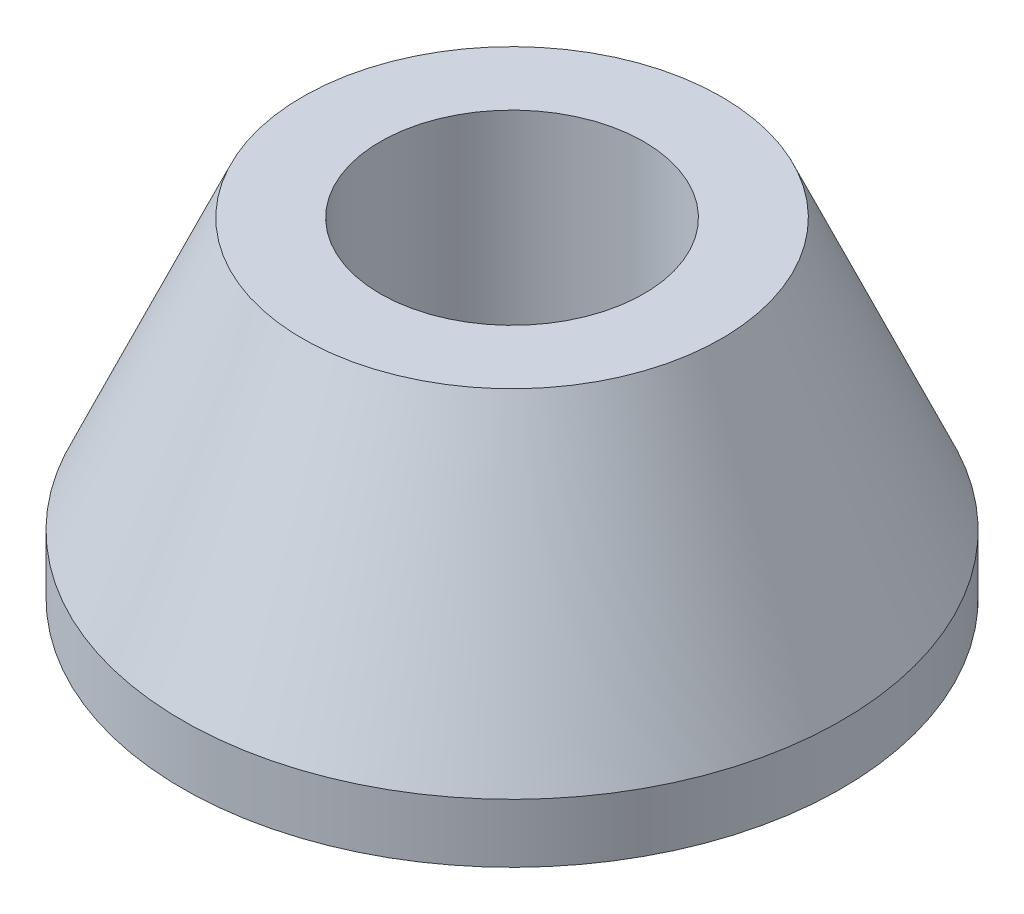
ISO-10303-21;
HEADER;
FILE_DESCRIPTION(('STEP AP214'),'2;1');
FILE_NAME('part.step','',(''),(''),'','','');
FILE_SCHEMA(('AUTOMOTIVE_DESIGN { 1 0 10303 214 1 1 1 1 }'));
ENDSEC;
DATA;
#1=APPLICATION_CONTEXT('core data for automotive mechanical design processes');
#2=APPLICATION_PROTOCOL_DEFINITION('international standard','automotive_design',2000,#1);
#3=PRODUCT_CONTEXT('',#1,'mechanical');
#4=PRODUCT('Part','Part','',(#3));
#5=PRODUCT_RELATED_PRODUCT_CATEGORY('part','',(#4));
#6=PRODUCT_DEFINITION_FORMATION('','',#4);
#7=PRODUCT_DEFINITION_CONTEXT('part definition',#1,'design');
#8=PRODUCT_DEFINITION('design','',#6,#7);
#9=PRODUCT_DEFINITION_SHAPE('','',#8);
#10=(LENGTH_UNIT() NAMED_UNIT(*) SI_UNIT(.MILLI.,.METRE.));
#11=(NAMED_UNIT(*) PLANE_ANGLE_UNIT() SI_UNIT($,.RADIAN.));
#12=(NAMED_UNIT(*) SI_UNIT($,.STERADIAN.) SOLID_ANGLE_UNIT());
#13=UNCERTAINTY_MEASURE_WITH_UNIT(LENGTH_MEASURE(1.E-05),#10,'distance_accuracy_value','');
#14=(GEOMETRIC_REPRESENTATION_CONTEXT(3) GLOBAL_UNCERTAINTY_ASSIGNED_CONTEXT((#13)) GLOBAL_UNIT_ASSIGNED_CONTEXT((#10,
#11,#12)) REPRESENTATION_CONTEXT('',''));
#15=CARTESIAN_POINT('',(0.,0.,0.));
#16=DIRECTION('',(0.,0.,1.));
#17=DIRECTION('',(1.,0.,0.));
#18=AXIS2_PLACEMENT_3D('',#15,#16,#17);
#19=CARTESIAN_POINT('',(0.,0.,0.));
#20=DIRECTION('',(0.,-1.,0.));
#21=DIRECTION('',(0.,0.,-1.));
#22=AXIS2_PLACEMENT_3D('',#19,#20,#21);
#23=CYLINDRICAL_SURFACE('',#22,2.43619489559165);
#24=CARTESIAN_POINT('',(0.,0.,0.));
#25=DIRECTION('',(0.,-1.,0.));
#26=DIRECTION('',(0.,0.,-1.));
#27=AXIS2_PLACEMENT_3D('',#24,#25,#26);
#28=CIRCLE('',#27,2.43619489559165);
#29=CARTESIAN_POINT('',(0.,0.,-2.43619489559165));
#30=VERTEX_POINT('',#29);
#31=EDGE_CURVE('E58',#30,#30,#28,.T.);
#32=ORIENTED_EDGE('',*,*,#31,.T.);
#33=EDGE_LOOP('',(#32));
#34=FACE_BOUND('',#33,.T.);
#35=CARTESIAN_POINT('',(0.,2.,0.));
#36=DIRECTION('',(0.,-1.,0.));
#37=DIRECTION('',(0.,0.,-1.));
#38=AXIS2_PLACEMENT_3D('',#35,#36,#37);
#39=CIRCLE('',#38,2.43619489559165);
#40=CARTESIAN_POINT('',(0.,2.,-2.43619489559165));
#41=VERTEX_POINT('',#40);
#42=EDGE_CURVE('E10',#41,#41,#39,.T.);
#43=ORIENTED_EDGE('',*,*,#42,.F.);
#44=EDGE_LOOP('',(#43));
#45=FACE_BOUND('',#44,.T.);
#46=ADVANCED_FACE('F33',(#34,#45),#23,.F.);
#47=CARTESIAN_POINT('',(0.,2.,0.));
#48=DIRECTION('',(0.,1.,0.));
#49=DIRECTION('',(0.,0.,1.));
#50=AXIS2_PLACEMENT_3D('',#47,#48,#49);
#51=PLANE('',#50);
#52=ORIENTED_EDGE('',*,*,#42,.T.);
#53=EDGE_LOOP('',(#52));
#54=FACE_BOUND('',#53,.T.);
#55=CARTESIAN_POINT('',(0.,2.,0.));
#56=DIRECTION('',(0.,-1.,0.));
#57=DIRECTION('',(0.,0.,-1.));
#58=AXIS2_PLACEMENT_3D('',#55,#56,#57);
#59=CIRCLE('',#58,6.);
#60=CARTESIAN_POINT('',(0.,2.,-6.));
#61=VERTEX_POINT('',#60);
#62=EDGE_CURVE('E39',#61,#61,#59,.T.);
#63=ORIENTED_EDGE('',*,*,#62,.F.);
#64=EDGE_LOOP('',(#63));
#65=FACE_BOUND('',#64,.T.);
#66=ADVANCED_FACE('F76',(#54,#65),#51,.T.);
#67=CARTESIAN_POINT('',(0.,0.,0.));
#68=DIRECTION('',(0.,-1.,0.));
#69=DIRECTION('',(0.,0.,-1.));
#70=AXIS2_PLACEMENT_3D('',#67,#68,#69);
#71=CYLINDRICAL_SURFACE('',#70,6.);
#72=ORIENTED_EDGE('',*,*,#62,.T.);
#73=EDGE_LOOP('',(#72));
#74=FACE_BOUND('',#73,.T.);
#75=CARTESIAN_POINT('',(0.,15.,0.));
#76=DIRECTION('',(0.,-1.,0.));
#77=DIRECTION('',(0.,0.,-1.));
#78=AXIS2_PLACEMENT_3D('',#75,#76,#77);
#79=CIRCLE('',#78,6.);
#80=CARTESIAN_POINT('',(0.,15.,-6.));
#81=VERTEX_POINT('',#80);
#82=EDGE_CURVE('E43',#81,#81,#79,.T.);
#83=ORIENTED_EDGE('',*,*,#82,.F.);
#84=EDGE_LOOP('',(#83));
#85=FACE_BOUND('',#84,.T.);
#86=ADVANCED_FACE('F80',(#74,#85),#71,.F.);
#87=CARTESIAN_POINT('',(0.,15.,0.));
#88=DIRECTION('',(0.,1.,0.));
#89=DIRECTION('',(0.,0.,1.));
#90=AXIS2_PLACEMENT_3D('',#87,#88,#89);
#91=PLANE('',#90);
#92=ORIENTED_EDGE('',*,*,#82,.T.);
#93=EDGE_LOOP('',(#92));
#94=FACE_BOUND('',#93,.T.);
#95=CARTESIAN_POINT('',(0.,15.,0.));
#96=DIRECTION('',(0.,-1.,0.));
#97=DIRECTION('',(0.,0.,-1.));
#98=AXIS2_PLACEMENT_3D('',#95,#96,#97);
#99=CIRCLE('',#98,9.53596287703015);
#100=CARTESIAN_POINT('',(0.,15.,-9.53596287703015));
#101=VERTEX_POINT('',#100);
#102=EDGE_CURVE('E47',#101,#101,#99,.T.);
#103=ORIENTED_EDGE('',*,*,#102,.F.);
#104=EDGE_LOOP('',(#103));
#105=FACE_BOUND('',#104,.T.);
#106=ADVANCED_FACE('F84',(#94,#105),#91,.T.);
#107=CARTESIAN_POINT('',(0.,2.67981438515081,0.));
#108=DIRECTION('',(0.,-1.,0.));
#109=DIRECTION('',(0.,0.,-1.));
#110=AXIS2_PLACEMENT_3D('',#107,#108,#109);
#111=CONICAL_SURFACE('',#110,15.,0.417437753967982);
#112=ORIENTED_EDGE('',*,*,#102,.T.);
#113=EDGE_LOOP('',(#112));
#114=FACE_BOUND('',#113,.T.);
#115=CARTESIAN_POINT('',(0.,2.67981438515081,0.));
#116=DIRECTION('',(0.,-1.,0.));
#117=DIRECTION('',(0.,0.,-1.));
#118=AXIS2_PLACEMENT_3D('',#115,#116,#117);
#119=CIRCLE('',#118,15.);
#120=CARTESIAN_POINT('',(0.,2.67981438515081,-15.));
#121=VERTEX_POINT('',#120);
#122=EDGE_CURVE('E52',#121,#121,#119,.T.);
#123=ORIENTED_EDGE('',*,*,#122,.F.);
#124=EDGE_LOOP('',(#123));
#125=FACE_BOUND('',#124,.T.);
#126=ADVANCED_FACE('F72',(#114,#125),#111,.T.);
#127=CARTESIAN_POINT('',(0.,0.,0.));
#128=DIRECTION('',(0.,-1.,0.));
#129=DIRECTION('',(0.,0.,-1.));
#130=AXIS2_PLACEMENT_3D('',#127,#128,#129);
#131=CYLINDRICAL_SURFACE('',#130,15.);
#132=ORIENTED_EDGE('',*,*,#122,.T.);
#133=EDGE_LOOP('',(#132));
#134=FACE_BOUND('',#133,.T.);
#135=CARTESIAN_POINT('',(0.,0.,0.));
#136=DIRECTION('',(0.,-1.,0.));
#137=DIRECTION('',(0.,0.,-1.));
#138=AXIS2_PLACEMENT_3D('',#135,#136,#137);
#139=CIRCLE('',#138,15.);
#140=CARTESIAN_POINT('',(0.,0.,-15.));
#141=VERTEX_POINT('',#140);
#142=EDGE_CURVE('E55',#141,#141,#139,.T.);
#143=ORIENTED_EDGE('',*,*,#142,.F.);
#144=EDGE_LOOP('',(#143));
#145=FACE_BOUND('',#144,.T.);
#146=ADVANCED_FACE('F66',(#134,#145),#131,.T.);
#147=CARTESIAN_POINT('',(0.,0.,0.));
#148=DIRECTION('',(0.,-1.,0.));
#149=DIRECTION('',(0.,0.,-1.));
#150=AXIS2_PLACEMENT_3D('',#147,#148,#149);
#151=PLANE('',#150);
#152=ORIENTED_EDGE('',*,*,#142,.T.);
#153=EDGE_LOOP('',(#152));
#154=FACE_BOUND('',#153,.T.);
#155=ORIENTED_EDGE('',*,*,#31,.F.);
#156=EDGE_LOOP('',(#155));
#157=FACE_BOUND('',#156,.T.);
#158=ADVANCED_FACE('F64',(#154,#157),#151,.T.);
#159=CLOSED_SHELL('',(#46,#66,#86,#106,#126,#146,#158));
#160=MANIFOLD_SOLID_BREP('B2',#159);
#161=ADVANCED_BREP_SHAPE_REPRESENTATION('',(#18,#160),#14);
#162=SHAPE_DEFINITION_REPRESENTATION(#9,#161);
ENDSEC;
END-ISO-10303-21;
